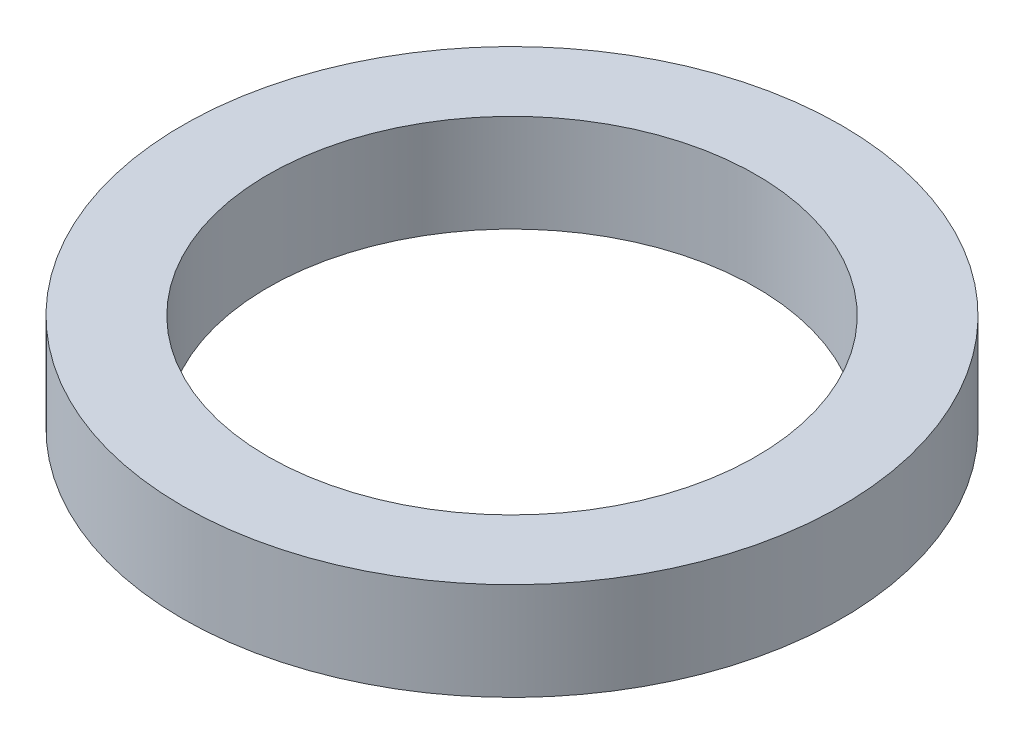
ISO-10303-21;
HEADER;
FILE_DESCRIPTION(('STEP AP214'),'2;1');
FILE_NAME('part.step','',(''),(''),'','','');
FILE_SCHEMA(('AUTOMOTIVE_DESIGN { 1 0 10303 214 1 1 1 1 }'));
ENDSEC;
DATA;
#1=APPLICATION_CONTEXT('core data for automotive mechanical design processes');
#2=APPLICATION_PROTOCOL_DEFINITION('international standard','automotive_design',2000,#1);
#3=PRODUCT_CONTEXT('',#1,'mechanical');
#4=PRODUCT('Part','Part','',(#3));
#5=PRODUCT_RELATED_PRODUCT_CATEGORY('part','',(#4));
#6=PRODUCT_DEFINITION_FORMATION('','',#4);
#7=PRODUCT_DEFINITION_CONTEXT('part definition',#1,'design');
#8=PRODUCT_DEFINITION('design','',#6,#7);
#9=PRODUCT_DEFINITION_SHAPE('','',#8);
#10=(LENGTH_UNIT() NAMED_UNIT(*) SI_UNIT(.MILLI.,.METRE.));
#11=(NAMED_UNIT(*) PLANE_ANGLE_UNIT() SI_UNIT($,.RADIAN.));
#12=(NAMED_UNIT(*) SI_UNIT($,.STERADIAN.) SOLID_ANGLE_UNIT());
#13=UNCERTAINTY_MEASURE_WITH_UNIT(LENGTH_MEASURE(1.E-05),#10,'distance_accuracy_value','');
#14=(GEOMETRIC_REPRESENTATION_CONTEXT(3) GLOBAL_UNCERTAINTY_ASSIGNED_CONTEXT((#13)) GLOBAL_UNIT_ASSIGNED_CONTEXT((#10,
#11,#12)) REPRESENTATION_CONTEXT('',''));
#15=CARTESIAN_POINT('',(0.,0.,0.));
#16=DIRECTION('',(0.,0.,1.));
#17=DIRECTION('',(1.,0.,0.));
#18=AXIS2_PLACEMENT_3D('',#15,#16,#17);
#19=CARTESIAN_POINT('',(0.,4.,0.));
#20=DIRECTION('',(0.,1.,0.));
#21=DIRECTION('',(0.,0.,1.));
#22=AXIS2_PLACEMENT_3D('',#19,#20,#21);
#23=PLANE('',#22);
#24=CARTESIAN_POINT('',(0.,4.,0.));
#25=DIRECTION('',(0.,1.,0.));
#26=DIRECTION('',(0.,0.,1.));
#27=AXIS2_PLACEMENT_3D('',#24,#25,#26);
#28=CIRCLE('',#27,13.5);
#29=CARTESIAN_POINT('',(0.,4.,13.5));
#30=VERTEX_POINT('',#29);
#31=EDGE_CURVE('E10',#30,#30,#28,.T.);
#32=ORIENTED_EDGE('',*,*,#31,.T.);
#33=EDGE_LOOP('',(#32));
#34=FACE_BOUND('',#33,.T.);
#35=CARTESIAN_POINT('',(0.,4.,0.));
#36=DIRECTION('',(0.,1.,0.));
#37=DIRECTION('',(0.,0.,1.));
#38=AXIS2_PLACEMENT_3D('',#35,#36,#37);
#39=CIRCLE('',#38,10.);
#40=CARTESIAN_POINT('',(0.,4.,10.));
#41=VERTEX_POINT('',#40);
#42=EDGE_CURVE('E50',#41,#41,#39,.T.);
#43=ORIENTED_EDGE('',*,*,#42,.F.);
#44=EDGE_LOOP('',(#43));
#45=FACE_BOUND('',#44,.T.);
#46=ADVANCED_FACE('F37',(#34,#45),#23,.T.);
#47=CARTESIAN_POINT('',(0.,0.,0.));
#48=DIRECTION('',(0.,1.,0.));
#49=DIRECTION('',(0.,0.,1.));
#50=AXIS2_PLACEMENT_3D('',#47,#48,#49);
#51=PLANE('',#50);
#52=CARTESIAN_POINT('',(0.,0.,0.));
#53=DIRECTION('',(0.,1.,0.));
#54=DIRECTION('',(0.,0.,1.));
#55=AXIS2_PLACEMENT_3D('',#52,#53,#54);
#56=CIRCLE('',#55,13.5);
#57=CARTESIAN_POINT('',(0.,0.,13.5));
#58=VERTEX_POINT('',#57);
#59=EDGE_CURVE('E41',#58,#58,#56,.T.);
#60=ORIENTED_EDGE('',*,*,#59,.F.);
#61=EDGE_LOOP('',(#60));
#62=FACE_BOUND('',#61,.T.);
#63=CARTESIAN_POINT('',(0.,0.,0.));
#64=DIRECTION('',(0.,1.,0.));
#65=DIRECTION('',(0.,0.,1.));
#66=AXIS2_PLACEMENT_3D('',#63,#64,#65);
#67=CIRCLE('',#66,10.);
#68=CARTESIAN_POINT('',(0.,0.,10.));
#69=VERTEX_POINT('',#68);
#70=EDGE_CURVE('E52',#69,#69,#67,.T.);
#71=ORIENTED_EDGE('',*,*,#70,.T.);
#72=EDGE_LOOP('',(#71));
#73=FACE_BOUND('',#72,.T.);
#74=ADVANCED_FACE('F64',(#62,#73),#51,.F.);
#75=CARTESIAN_POINT('',(0.,4.,0.));
#76=DIRECTION('',(0.,-1.,0.));
#77=DIRECTION('',(0.,0.,-1.));
#78=AXIS2_PLACEMENT_3D('',#75,#76,#77);
#79=CYLINDRICAL_SURFACE('',#78,13.5);
#80=ORIENTED_EDGE('',*,*,#31,.F.);
#81=EDGE_LOOP('',(#80));
#82=FACE_BOUND('',#81,.T.);
#83=ORIENTED_EDGE('',*,*,#59,.T.);
#84=EDGE_LOOP('',(#83));
#85=FACE_BOUND('',#84,.T.);
#86=ADVANCED_FACE('F39',(#82,#85),#79,.T.);
#87=CARTESIAN_POINT('',(0.,4.,0.));
#88=DIRECTION('',(0.,-1.,0.));
#89=DIRECTION('',(0.,0.,-1.));
#90=AXIS2_PLACEMENT_3D('',#87,#88,#89);
#91=CYLINDRICAL_SURFACE('',#90,10.);
#92=ORIENTED_EDGE('',*,*,#42,.T.);
#93=EDGE_LOOP('',(#92));
#94=FACE_BOUND('',#93,.T.);
#95=ORIENTED_EDGE('',*,*,#70,.F.);
#96=EDGE_LOOP('',(#95));
#97=FACE_BOUND('',#96,.T.);
#98=ADVANCED_FACE('F60',(#94,#97),#91,.F.);
#99=CLOSED_SHELL('',(#46,#74,#86,#98));
#100=MANIFOLD_SOLID_BREP('B2',#99);
#101=ADVANCED_BREP_SHAPE_REPRESENTATION('',(#18,#100),#14);
#102=SHAPE_DEFINITION_REPRESENTATION(#9,#101);
ENDSEC;
END-ISO-10303-21;
